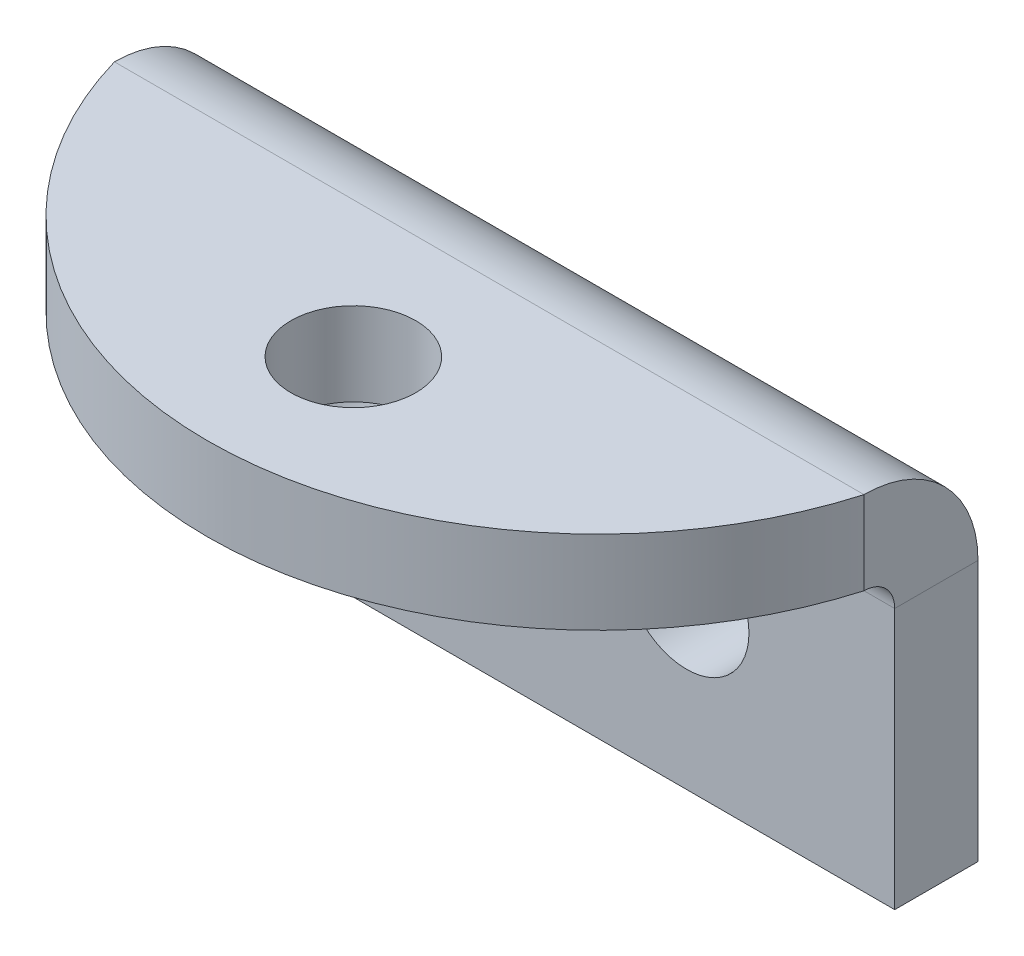
ISO-10303-21;
HEADER;
FILE_DESCRIPTION(('STEP AP214'),'2;1');
FILE_NAME('part.step','',(''),(''),'','','');
FILE_SCHEMA(('AUTOMOTIVE_DESIGN { 1 0 10303 214 1 1 1 1 }'));
ENDSEC;
DATA;
#1=APPLICATION_CONTEXT('core data for automotive mechanical design processes');
#2=APPLICATION_PROTOCOL_DEFINITION('international standard','automotive_design',2000,#1);
#3=PRODUCT_CONTEXT('',#1,'mechanical');
#4=PRODUCT('Part','Part','',(#3));
#5=PRODUCT_RELATED_PRODUCT_CATEGORY('part','',(#4));
#6=PRODUCT_DEFINITION_FORMATION('','',#4);
#7=PRODUCT_DEFINITION_CONTEXT('part definition',#1,'design');
#8=PRODUCT_DEFINITION('design','',#6,#7);
#9=PRODUCT_DEFINITION_SHAPE('','',#8);
#10=(LENGTH_UNIT() NAMED_UNIT(*) SI_UNIT(.MILLI.,.METRE.));
#11=(NAMED_UNIT(*) PLANE_ANGLE_UNIT() SI_UNIT($,.RADIAN.));
#12=(NAMED_UNIT(*) SI_UNIT($,.STERADIAN.) SOLID_ANGLE_UNIT());
#13=UNCERTAINTY_MEASURE_WITH_UNIT(LENGTH_MEASURE(1.E-05),#10,'distance_accuracy_value','');
#14=(GEOMETRIC_REPRESENTATION_CONTEXT(3) GLOBAL_UNCERTAINTY_ASSIGNED_CONTEXT((#13)) GLOBAL_UNIT_ASSIGNED_CONTEXT((#10,
#11,#12)) REPRESENTATION_CONTEXT('',''));
#15=CARTESIAN_POINT('',(0.,0.,0.));
#16=DIRECTION('',(0.,0.,1.));
#17=DIRECTION('',(1.,0.,0.));
#18=AXIS2_PLACEMENT_3D('',#15,#16,#17);
#19=CARTESIAN_POINT('',(0.,0.,0.));
#20=DIRECTION('',(0.,-1.,0.));
#21=DIRECTION('',(0.,0.,-1.));
#22=AXIS2_PLACEMENT_3D('',#19,#20,#21);
#23=PLANE('',#22);
#24=CARTESIAN_POINT('',(8.99999999999999,0.,-1.86981248780202));
#25=DIRECTION('',(0.,-1.,0.));
#26=DIRECTION('',(0.,0.,-1.));
#27=AXIS2_PLACEMENT_3D('',#24,#25,#26);
#28=CIRCLE('',#27,9.369812487802);
#29=CARTESIAN_POINT('',(0.,0.,0.736599999999976));
#30=VERTEX_POINT('',#29);
#31=CARTESIAN_POINT('',(18.,0.,0.73659999999999));
#32=VERTEX_POINT('',#31);
#33=EDGE_CURVE('E161',#30,#32,#28,.F.);
#34=ORIENTED_EDGE('',*,*,#33,.T.);
#35=DIRECTION('',(-1.,0.,0.));
#36=VECTOR('',#35,1.);
#37=CARTESIAN_POINT('',(18.,0.,0.73659999999999));
#38=LINE('',#37,#36);
#39=EDGE_CURVE('E136',#30,#32,#38,.F.);
#40=ORIENTED_EDGE('',*,*,#39,.F.);
#41=EDGE_LOOP('',(#34,#40));
#42=FACE_BOUND('',#41,.T.);
#43=CARTESIAN_POINT('',(8.99999999999999,0.,4.));
#44=DIRECTION('',(0.,-1.,0.));
#45=DIRECTION('',(0.,0.,-1.));
#46=AXIS2_PLACEMENT_3D('',#43,#44,#45);
#47=CIRCLE('',#46,1.5);
#48=CARTESIAN_POINT('',(8.99999999999999,0.,2.50000000000001));
#49=VERTEX_POINT('',#48);
#50=EDGE_CURVE('E164',#49,#49,#47,.T.);
#51=ORIENTED_EDGE('',*,*,#50,.T.);
#52=EDGE_LOOP('',(#51));
#53=FACE_BOUND('',#52,.T.);
#54=ADVANCED_FACE('F58',(#42,#53),#23,.F.);
#55=CARTESIAN_POINT('',(0.,-2.00000000000006,0.));
#56=DIRECTION('',(0.,-1.,0.));
#57=DIRECTION('',(0.,0.,-1.));
#58=AXIS2_PLACEMENT_3D('',#55,#56,#57);
#59=PLANE('',#58);
#60=DIRECTION('',(-1.,0.,0.));
#61=VECTOR('',#60,1.);
#62=CARTESIAN_POINT('',(18.,-1.99999999999995,0.736600000000004));
#63=LINE('',#62,#61);
#64=CARTESIAN_POINT('',(18.,-1.99999999999995,0.736600000000004));
#65=VERTEX_POINT('',#64);
#66=CARTESIAN_POINT('',(0.,-2.,0.736600000000018));
#67=VERTEX_POINT('',#66);
#68=EDGE_CURVE('E152',#65,#67,#63,.T.);
#69=ORIENTED_EDGE('',*,*,#68,.F.);
#70=CARTESIAN_POINT('',(8.99999999999999,-1.99999999999995,-1.86981248780202));
#71=DIRECTION('',(0.,-1.,0.));
#72=DIRECTION('',(0.,0.,-1.));
#73=AXIS2_PLACEMENT_3D('',#70,#71,#72);
#74=CIRCLE('',#73,9.369812487802);
#75=EDGE_CURVE('E153',#67,#65,#74,.F.);
#76=ORIENTED_EDGE('',*,*,#75,.F.);
#77=EDGE_LOOP('',(#69,#76));
#78=FACE_BOUND('',#77,.T.);
#79=CARTESIAN_POINT('',(8.99999999999999,-2.,4.));
#80=DIRECTION('',(0.,-1.,0.));
#81=DIRECTION('',(0.,0.,-1.));
#82=AXIS2_PLACEMENT_3D('',#79,#80,#81);
#83=CIRCLE('',#82,1.5);
#84=CARTESIAN_POINT('',(8.99999999999999,-2.00000000000001,2.50000000000001));
#85=VERTEX_POINT('',#84);
#86=EDGE_CURVE('E167',#85,#85,#83,.T.);
#87=ORIENTED_EDGE('',*,*,#86,.F.);
#88=EDGE_LOOP('',(#87));
#89=FACE_BOUND('',#88,.T.);
#90=ADVANCED_FACE('F181',(#78,#89),#59,.T.);
#91=CARTESIAN_POINT('',(0.,0.,-1.99999999999999));
#92=DIRECTION('',(-1.,0.,0.));
#93=DIRECTION('',(0.,-1.,0.));
#94=AXIS2_PLACEMENT_3D('',#91,#92,#93);
#95=PLANE('',#94);
#96=DIRECTION('',(0.,-1.,0.));
#97=VECTOR('',#96,1.);
#98=CARTESIAN_POINT('',(0.,0.,0.));
#99=LINE('',#98,#97);
#100=CARTESIAN_POINT('',(0.,-2.73659999999998,0.));
#101=VERTEX_POINT('',#100);
#102=CARTESIAN_POINT('',(0.,-9.00000000000001,0.));
#103=VERTEX_POINT('',#102);
#104=EDGE_CURVE('E107',#101,#103,#99,.T.);
#105=ORIENTED_EDGE('',*,*,#104,.F.);
#106=DIRECTION('',(0.,0.,-1.));
#107=VECTOR('',#106,1.);
#108=CARTESIAN_POINT('',(0.,-2.73659999999998,0.));
#109=LINE('',#108,#107);
#110=CARTESIAN_POINT('',(0.,-2.73659999999998,-1.99999999999999));
#111=VERTEX_POINT('',#110);
#112=EDGE_CURVE('E128',#101,#111,#109,.T.);
#113=ORIENTED_EDGE('',*,*,#112,.T.);
#114=DIRECTION('',(0.,-1.,0.));
#115=VECTOR('',#114,1.);
#116=CARTESIAN_POINT('',(0.,0.,-1.99999999999999));
#117=LINE('',#116,#115);
#118=CARTESIAN_POINT('',(0.,-9.00000000000001,-1.99999999999999));
#119=VERTEX_POINT('',#118);
#120=EDGE_CURVE('E104',#111,#119,#117,.T.);
#121=ORIENTED_EDGE('',*,*,#120,.T.);
#122=DIRECTION('',(0.,0.,1.));
#123=VECTOR('',#122,1.);
#124=CARTESIAN_POINT('',(0.,-9.00000000000001,-1.99999999999999));
#125=LINE('',#124,#123);
#126=EDGE_CURVE('E62',#119,#103,#125,.T.);
#127=ORIENTED_EDGE('',*,*,#126,.T.);
#128=EDGE_LOOP('',(#105,#113,#121,#127));
#129=FACE_BOUND('',#128,.T.);
#130=ADVANCED_FACE('F60',(#129),#95,.T.);
#131=CARTESIAN_POINT('',(0.,0.,-1.99999999999999));
#132=DIRECTION('',(0.,0.,1.));
#133=DIRECTION('',(1.,0.,0.));
#134=AXIS2_PLACEMENT_3D('',#131,#132,#133);
#135=PLANE('',#134);
#136=CARTESIAN_POINT('',(4.99999999999998,-5.,-1.99999999999999));
#137=DIRECTION('',(0.,0.,1.));
#138=DIRECTION('',(1.,0.,0.));
#139=AXIS2_PLACEMENT_3D('',#136,#137,#138);
#140=CIRCLE('',#139,1.5);
#141=CARTESIAN_POINT('',(6.49999999999998,-5.,-1.99999999999999));
#142=VERTEX_POINT('',#141);
#143=EDGE_CURVE('E110',#142,#142,#140,.T.);
#144=ORIENTED_EDGE('',*,*,#143,.T.);
#145=EDGE_LOOP('',(#144));
#146=FACE_BOUND('',#145,.T.);
#147=CARTESIAN_POINT('',(13.,-4.99999999999995,-2.));
#148=DIRECTION('',(0.,0.,1.));
#149=DIRECTION('',(1.,0.,0.));
#150=AXIS2_PLACEMENT_3D('',#147,#148,#149);
#151=CIRCLE('',#150,1.5);
#152=CARTESIAN_POINT('',(14.5,-4.99999999999995,-2.));
#153=VERTEX_POINT('',#152);
#154=EDGE_CURVE('E120',#153,#153,#151,.T.);
#155=ORIENTED_EDGE('',*,*,#154,.T.);
#156=EDGE_LOOP('',(#155));
#157=FACE_BOUND('',#156,.T.);
#158=DIRECTION('',(-1.,0.,0.));
#159=VECTOR('',#158,1.);
#160=CARTESIAN_POINT('',(0.,-2.73659999999998,-1.99999999999999));
#161=LINE('',#160,#159);
#162=CARTESIAN_POINT('',(18.,-2.73659999999998,-2.));
#163=VERTEX_POINT('',#162);
#164=EDGE_CURVE('E144',#111,#163,#161,.F.);
#165=ORIENTED_EDGE('',*,*,#164,.T.);
#166=DIRECTION('',(0.,1.,0.));
#167=VECTOR('',#166,1.);
#168=CARTESIAN_POINT('',(18.,0.,-2.));
#169=LINE('',#168,#167);
#170=CARTESIAN_POINT('',(18.,-9.00000000000001,-2.));
#171=VERTEX_POINT('',#170);
#172=EDGE_CURVE('E113',#171,#163,#169,.T.);
#173=ORIENTED_EDGE('',*,*,#172,.F.);
#174=DIRECTION('',(1.,0.,0.));
#175=VECTOR('',#174,1.);
#176=CARTESIAN_POINT('',(0.,-9.00000000000001,-1.99999999999999));
#177=LINE('',#176,#175);
#178=EDGE_CURVE('E97',#119,#171,#177,.T.);
#179=ORIENTED_EDGE('',*,*,#178,.F.);
#180=ORIENTED_EDGE('',*,*,#120,.F.);
#181=EDGE_LOOP('',(#165,#173,#179,#180));
#182=FACE_BOUND('',#181,.T.);
#183=ADVANCED_FACE('F189',(#146,#157,#182),#135,.F.);
#184=CARTESIAN_POINT('',(0.,0.,0.));
#185=DIRECTION('',(0.,0.,1.));
#186=DIRECTION('',(1.,0.,0.));
#187=AXIS2_PLACEMENT_3D('',#184,#185,#186);
#188=PLANE('',#187);
#189=CARTESIAN_POINT('',(4.99999999999999,-4.99999999999989,0.));
#190=DIRECTION('',(0.,0.,1.));
#191=DIRECTION('',(1.,0.,0.));
#192=AXIS2_PLACEMENT_3D('',#189,#190,#191);
#193=CIRCLE('',#192,1.5);
#194=CARTESIAN_POINT('',(6.49999999999999,-4.99999999999989,0.));
#195=VERTEX_POINT('',#194);
#196=EDGE_CURVE('E117',#195,#195,#193,.T.);
#197=ORIENTED_EDGE('',*,*,#196,.F.);
#198=EDGE_LOOP('',(#197));
#199=FACE_BOUND('',#198,.T.);
#200=CARTESIAN_POINT('',(13.,-5.,0.));
#201=DIRECTION('',(0.,0.,1.));
#202=DIRECTION('',(1.,0.,0.));
#203=AXIS2_PLACEMENT_3D('',#200,#201,#202);
#204=CIRCLE('',#203,1.5);
#205=CARTESIAN_POINT('',(14.5,-5.,0.));
#206=VERTEX_POINT('',#205);
#207=EDGE_CURVE('E123',#206,#206,#204,.T.);
#208=ORIENTED_EDGE('',*,*,#207,.F.);
#209=EDGE_LOOP('',(#208));
#210=FACE_BOUND('',#209,.T.);
#211=DIRECTION('',(0.,1.,0.));
#212=VECTOR('',#211,1.);
#213=CARTESIAN_POINT('',(18.,0.,0.));
#214=LINE('',#213,#212);
#215=CARTESIAN_POINT('',(18.,-9.00000000000001,0.));
#216=VERTEX_POINT('',#215);
#217=CARTESIAN_POINT('',(18.,-2.73659999999998,0.));
#218=VERTEX_POINT('',#217);
#219=EDGE_CURVE('E99',#216,#218,#214,.T.);
#220=ORIENTED_EDGE('',*,*,#219,.T.);
#221=DIRECTION('',(-1.,0.,0.));
#222=VECTOR('',#221,1.);
#223=CARTESIAN_POINT('',(0.,-2.73659999999998,0.));
#224=LINE('',#223,#222);
#225=EDGE_CURVE('E73',#101,#218,#224,.F.);
#226=ORIENTED_EDGE('',*,*,#225,.F.);
#227=ORIENTED_EDGE('',*,*,#104,.T.);
#228=DIRECTION('',(1.,0.,0.));
#229=VECTOR('',#228,1.);
#230=CARTESIAN_POINT('',(0.,-9.00000000000001,0.));
#231=LINE('',#230,#229);
#232=EDGE_CURVE('E95',#103,#216,#231,.T.);
#233=ORIENTED_EDGE('',*,*,#232,.T.);
#234=EDGE_LOOP('',(#220,#226,#227,#233));
#235=FACE_BOUND('',#234,.T.);
#236=ADVANCED_FACE('F106',(#199,#210,#235),#188,.T.);
#237=CARTESIAN_POINT('',(18.,0.,-2.));
#238=DIRECTION('',(1.,0.,0.));
#239=DIRECTION('',(0.,0.,-1.));
#240=AXIS2_PLACEMENT_3D('',#237,#238,#239);
#241=PLANE('',#240);
#242=DIRECTION('',(0.,0.,-1.));
#243=VECTOR('',#242,1.);
#244=CARTESIAN_POINT('',(18.,-2.73659999999998,0.));
#245=LINE('',#244,#243);
#246=EDGE_CURVE('E103',#218,#163,#245,.T.);
#247=ORIENTED_EDGE('',*,*,#246,.F.);
#248=ORIENTED_EDGE('',*,*,#219,.F.);
#249=DIRECTION('',(0.,0.,1.));
#250=VECTOR('',#249,1.);
#251=CARTESIAN_POINT('',(18.,-9.00000000000001,-2.));
#252=LINE('',#251,#250);
#253=EDGE_CURVE('E13',#171,#216,#252,.T.);
#254=ORIENTED_EDGE('',*,*,#253,.F.);
#255=ORIENTED_EDGE('',*,*,#172,.T.);
#256=EDGE_LOOP('',(#247,#248,#254,#255));
#257=FACE_BOUND('',#256,.T.);
#258=ADVANCED_FACE('F100',(#257),#241,.T.);
#259=CARTESIAN_POINT('',(0.,-9.00000000000001,-1.99999999999999));
#260=DIRECTION('',(0.,-1.,0.));
#261=DIRECTION('',(0.,0.,-1.));
#262=AXIS2_PLACEMENT_3D('',#259,#260,#261);
#263=PLANE('',#262);
#264=ORIENTED_EDGE('',*,*,#232,.F.);
#265=ORIENTED_EDGE('',*,*,#126,.F.);
#266=ORIENTED_EDGE('',*,*,#178,.T.);
#267=ORIENTED_EDGE('',*,*,#253,.T.);
#268=EDGE_LOOP('',(#264,#265,#266,#267));
#269=FACE_BOUND('',#268,.T.);
#270=ADVANCED_FACE('F92',(#269),#263,.T.);
#271=CARTESIAN_POINT('',(4.99999999999998,-5.,-1.99999999999999));
#272=DIRECTION('',(0.,0.,1.));
#273=DIRECTION('',(1.,0.,0.));
#274=AXIS2_PLACEMENT_3D('',#271,#272,#273);
#275=CYLINDRICAL_SURFACE('',#274,1.5);
#276=ORIENTED_EDGE('',*,*,#143,.F.);
#277=EDGE_LOOP('',(#276));
#278=FACE_BOUND('',#277,.T.);
#279=ORIENTED_EDGE('',*,*,#196,.T.);
#280=EDGE_LOOP('',(#279));
#281=FACE_BOUND('',#280,.T.);
#282=ADVANCED_FACE('F215',(#278,#281),#275,.F.);
#283=CARTESIAN_POINT('',(13.,-4.99999999999995,-2.));
#284=DIRECTION('',(0.,0.,1.));
#285=DIRECTION('',(1.,0.,0.));
#286=AXIS2_PLACEMENT_3D('',#283,#284,#285);
#287=CYLINDRICAL_SURFACE('',#286,1.5);
#288=ORIENTED_EDGE('',*,*,#154,.F.);
#289=EDGE_LOOP('',(#288));
#290=FACE_BOUND('',#289,.T.);
#291=ORIENTED_EDGE('',*,*,#207,.T.);
#292=EDGE_LOOP('',(#291));
#293=FACE_BOUND('',#292,.T.);
#294=ADVANCED_FACE('F208',(#290,#293),#287,.F.);
#295=CARTESIAN_POINT('',(18.,-2.73660000000003,0.736600000000004));
#296=DIRECTION('',(1.,0.,0.));
#297=DIRECTION('',(0.,0.,-1.));
#298=AXIS2_PLACEMENT_3D('',#295,#296,#297);
#299=PLANE('',#298);
#300=DIRECTION('',(0.,-1.,0.));
#301=VECTOR('',#300,1.);
#302=CARTESIAN_POINT('',(18.,0.,0.73659999999999));
#303=LINE('',#302,#301);
#304=EDGE_CURVE('E149',#65,#32,#303,.F.);
#305=ORIENTED_EDGE('',*,*,#304,.F.);
#306=CARTESIAN_POINT('',(18.,-2.73660000000003,0.736600000000004));
#307=DIRECTION('',(-1.,0.,0.));
#308=DIRECTION('',(0.,0.,1.));
#309=AXIS2_PLACEMENT_3D('',#306,#307,#308);
#310=CIRCLE('',#309,0.7366);
#311=EDGE_CURVE('E138',#218,#65,#310,.F.);
#312=ORIENTED_EDGE('',*,*,#311,.F.);
#313=ORIENTED_EDGE('',*,*,#246,.T.);
#314=CARTESIAN_POINT('',(18.,-2.73660000000003,0.736600000000004));
#315=DIRECTION('',(-1.,0.,0.));
#316=DIRECTION('',(0.,0.,1.));
#317=AXIS2_PLACEMENT_3D('',#314,#315,#316);
#318=CIRCLE('',#317,2.7366);
#319=EDGE_CURVE('E131',#163,#32,#318,.F.);
#320=ORIENTED_EDGE('',*,*,#319,.T.);
#321=EDGE_LOOP('',(#305,#312,#313,#320));
#322=FACE_BOUND('',#321,.T.);
#323=ADVANCED_FACE('F205',(#322),#299,.T.);
#324=CARTESIAN_POINT('',(0.,-2.73660000000003,0.736600000000018));
#325=DIRECTION('',(1.,0.,0.));
#326=DIRECTION('',(0.,0.,-1.));
#327=AXIS2_PLACEMENT_3D('',#324,#325,#326);
#328=PLANE('',#327);
#329=CARTESIAN_POINT('',(0.,-2.73660000000003,0.736600000000018));
#330=DIRECTION('',(-1.,0.,0.));
#331=DIRECTION('',(0.,0.,1.));
#332=AXIS2_PLACEMENT_3D('',#329,#330,#331);
#333=CIRCLE('',#332,0.7366);
#334=EDGE_CURVE('E133',#67,#101,#333,.T.);
#335=ORIENTED_EDGE('',*,*,#334,.F.);
#336=DIRECTION('',(0.,-1.,0.));
#337=VECTOR('',#336,1.);
#338=CARTESIAN_POINT('',(0.,-2.,0.736600000000018));
#339=LINE('',#338,#337);
#340=EDGE_CURVE('E156',#67,#30,#339,.F.);
#341=ORIENTED_EDGE('',*,*,#340,.T.);
#342=CARTESIAN_POINT('',(0.,-2.73660000000003,0.736600000000018));
#343=DIRECTION('',(-1.,0.,0.));
#344=DIRECTION('',(0.,0.,1.));
#345=AXIS2_PLACEMENT_3D('',#342,#343,#344);
#346=CIRCLE('',#345,2.7366);
#347=EDGE_CURVE('E141',#30,#111,#346,.T.);
#348=ORIENTED_EDGE('',*,*,#347,.T.);
#349=ORIENTED_EDGE('',*,*,#112,.F.);
#350=EDGE_LOOP('',(#335,#341,#348,#349));
#351=FACE_BOUND('',#350,.T.);
#352=ADVANCED_FACE('F200',(#351),#328,.F.);
#353=CARTESIAN_POINT('',(0.,-2.73660000000003,0.736600000000018));
#354=DIRECTION('',(-1.,0.,0.));
#355=DIRECTION('',(0.,1.,0.));
#356=AXIS2_PLACEMENT_3D('',#353,#354,#355);
#357=CYLINDRICAL_SURFACE('',#356,2.7366);
#358=ORIENTED_EDGE('',*,*,#164,.F.);
#359=ORIENTED_EDGE('',*,*,#347,.F.);
#360=ORIENTED_EDGE('',*,*,#39,.T.);
#361=ORIENTED_EDGE('',*,*,#319,.F.);
#362=EDGE_LOOP('',(#358,#359,#360,#361));
#363=FACE_BOUND('',#362,.T.);
#364=ADVANCED_FACE('F196',(#363),#357,.T.);
#365=CARTESIAN_POINT('',(0.,-2.73660000000003,0.736600000000018));
#366=DIRECTION('',(-1.,0.,0.));
#367=DIRECTION('',(0.,1.,0.));
#368=AXIS2_PLACEMENT_3D('',#365,#366,#367);
#369=CYLINDRICAL_SURFACE('',#368,0.7366);
#370=ORIENTED_EDGE('',*,*,#225,.T.);
#371=ORIENTED_EDGE('',*,*,#311,.T.);
#372=ORIENTED_EDGE('',*,*,#68,.T.);
#373=ORIENTED_EDGE('',*,*,#334,.T.);
#374=EDGE_LOOP('',(#370,#371,#372,#373));
#375=FACE_BOUND('',#374,.T.);
#376=ADVANCED_FACE('F199',(#375),#369,.F.);
#377=CARTESIAN_POINT('',(8.99999999999999,0.,-1.86981248780202));
#378=DIRECTION('',(0.,-1.,0.));
#379=DIRECTION('',(0.,0.,-1.));
#380=AXIS2_PLACEMENT_3D('',#377,#378,#379);
#381=CYLINDRICAL_SURFACE('',#380,9.369812487802);
#382=ORIENTED_EDGE('',*,*,#304,.T.);
#383=ORIENTED_EDGE('',*,*,#33,.F.);
#384=ORIENTED_EDGE('',*,*,#340,.F.);
#385=ORIENTED_EDGE('',*,*,#75,.T.);
#386=EDGE_LOOP('',(#382,#383,#384,#385));
#387=FACE_BOUND('',#386,.T.);
#388=ADVANCED_FACE('F177',(#387),#381,.T.);
#389=CARTESIAN_POINT('',(8.99999999999999,-2.,4.));
#390=DIRECTION('',(0.,-1.,0.));
#391=DIRECTION('',(0.,0.,-1.));
#392=AXIS2_PLACEMENT_3D('',#389,#390,#391);
#393=CYLINDRICAL_SURFACE('',#392,1.5);
#394=ORIENTED_EDGE('',*,*,#50,.F.);
#395=EDGE_LOOP('',(#394));
#396=FACE_BOUND('',#395,.T.);
#397=ORIENTED_EDGE('',*,*,#86,.T.);
#398=EDGE_LOOP('',(#397));
#399=FACE_BOUND('',#398,.T.);
#400=ADVANCED_FACE('F174',(#396,#399),#393,.F.);
#401=CLOSED_SHELL('',(#54,#90,#130,#183,#236,#258,#270,#282,#294,#323,#352,#364,#376,#388,#400));
#402=MANIFOLD_SOLID_BREP('B2',#401);
#403=ADVANCED_BREP_SHAPE_REPRESENTATION('',(#18,#402),#14);
#404=SHAPE_DEFINITION_REPRESENTATION(#9,#403);
ENDSEC;
END-ISO-10303-21;
